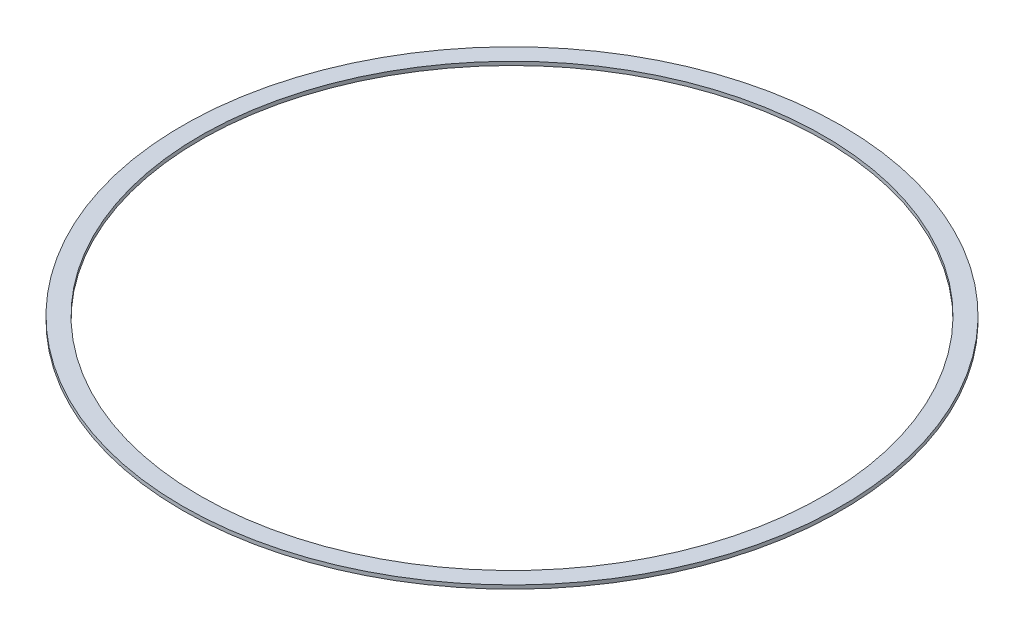
ISO-10303-21;
HEADER;
FILE_DESCRIPTION(('STEP AP214'),'2;1');
FILE_NAME('part.step','',(''),(''),'','','');
FILE_SCHEMA(('AUTOMOTIVE_DESIGN { 1 0 10303 214 1 1 1 1 }'));
ENDSEC;
DATA;
#1=APPLICATION_CONTEXT('core data for automotive mechanical design processes');
#2=APPLICATION_PROTOCOL_DEFINITION('international standard','automotive_design',2000,#1);
#3=PRODUCT_CONTEXT('',#1,'mechanical');
#4=PRODUCT('Part','Part','',(#3));
#5=PRODUCT_RELATED_PRODUCT_CATEGORY('part','',(#4));
#6=PRODUCT_DEFINITION_FORMATION('','',#4);
#7=PRODUCT_DEFINITION_CONTEXT('part definition',#1,'design');
#8=PRODUCT_DEFINITION('design','',#6,#7);
#9=PRODUCT_DEFINITION_SHAPE('','',#8);
#10=(LENGTH_UNIT() NAMED_UNIT(*) SI_UNIT(.MILLI.,.METRE.));
#11=(NAMED_UNIT(*) PLANE_ANGLE_UNIT() SI_UNIT($,.RADIAN.));
#12=(NAMED_UNIT(*) SI_UNIT($,.STERADIAN.) SOLID_ANGLE_UNIT());
#13=UNCERTAINTY_MEASURE_WITH_UNIT(LENGTH_MEASURE(1.E-05),#10,'distance_accuracy_value','');
#14=(GEOMETRIC_REPRESENTATION_CONTEXT(3) GLOBAL_UNCERTAINTY_ASSIGNED_CONTEXT((#13)) GLOBAL_UNIT_ASSIGNED_CONTEXT((#10,
#11,#12)) REPRESENTATION_CONTEXT('',''));
#15=CARTESIAN_POINT('',(0.,0.,0.));
#16=DIRECTION('',(0.,0.,1.));
#17=DIRECTION('',(1.,0.,0.));
#18=AXIS2_PLACEMENT_3D('',#15,#16,#17);
#19=CARTESIAN_POINT('',(0.,2.54,0.));
#20=DIRECTION('',(0.,1.,0.));
#21=DIRECTION('',(0.,0.,1.));
#22=AXIS2_PLACEMENT_3D('',#19,#20,#21);
#23=PLANE('',#22);
#24=CARTESIAN_POINT('',(0.,2.54,0.));
#25=DIRECTION('',(0.,1.,0.));
#26=DIRECTION('',(0.,0.,1.));
#27=AXIS2_PLACEMENT_3D('',#24,#25,#26);
#28=CIRCLE('',#27,226.8601);
#29=CARTESIAN_POINT('',(0.,2.54,226.8601));
#30=VERTEX_POINT('',#29);
#31=EDGE_CURVE('E10',#30,#30,#28,.T.);
#32=ORIENTED_EDGE('',*,*,#31,.T.);
#33=EDGE_LOOP('',(#32));
#34=FACE_BOUND('',#33,.T.);
#35=CARTESIAN_POINT('',(0.,2.54,0.));
#36=DIRECTION('',(0.,1.,0.));
#37=DIRECTION('',(0.,0.,1.));
#38=AXIS2_PLACEMENT_3D('',#35,#36,#37);
#39=CIRCLE('',#38,214.6681);
#40=CARTESIAN_POINT('',(0.,2.54,214.6681));
#41=VERTEX_POINT('',#40);
#42=EDGE_CURVE('E55',#41,#41,#39,.T.);
#43=ORIENTED_EDGE('',*,*,#42,.F.);
#44=EDGE_LOOP('',(#43));
#45=FACE_BOUND('',#44,.T.);
#46=ADVANCED_FACE('F42',(#34,#45),#23,.T.);
#47=CARTESIAN_POINT('',(0.,0.,0.));
#48=DIRECTION('',(0.,1.,0.));
#49=DIRECTION('',(0.,0.,1.));
#50=AXIS2_PLACEMENT_3D('',#47,#48,#49);
#51=PLANE('',#50);
#52=CARTESIAN_POINT('',(0.,0.,0.));
#53=DIRECTION('',(0.,1.,0.));
#54=DIRECTION('',(0.,0.,1.));
#55=AXIS2_PLACEMENT_3D('',#52,#53,#54);
#56=CIRCLE('',#55,226.8601);
#57=CARTESIAN_POINT('',(0.,0.,226.8601));
#58=VERTEX_POINT('',#57);
#59=EDGE_CURVE('E46',#58,#58,#56,.T.);
#60=ORIENTED_EDGE('',*,*,#59,.F.);
#61=EDGE_LOOP('',(#60));
#62=FACE_BOUND('',#61,.T.);
#63=CARTESIAN_POINT('',(0.,0.,0.));
#64=DIRECTION('',(0.,1.,0.));
#65=DIRECTION('',(0.,0.,1.));
#66=AXIS2_PLACEMENT_3D('',#63,#64,#65);
#67=CIRCLE('',#66,214.6681);
#68=CARTESIAN_POINT('',(0.,0.,214.6681));
#69=VERTEX_POINT('',#68);
#70=EDGE_CURVE('E57',#69,#69,#67,.T.);
#71=ORIENTED_EDGE('',*,*,#70,.T.);
#72=EDGE_LOOP('',(#71));
#73=FACE_BOUND('',#72,.T.);
#74=ADVANCED_FACE('F69',(#62,#73),#51,.F.);
#75=CARTESIAN_POINT('',(0.,2.54,0.));
#76=DIRECTION('',(0.,-1.,0.));
#77=DIRECTION('',(0.,0.,-1.));
#78=AXIS2_PLACEMENT_3D('',#75,#76,#77);
#79=CYLINDRICAL_SURFACE('',#78,226.8601);
#80=ORIENTED_EDGE('',*,*,#31,.F.);
#81=EDGE_LOOP('',(#80));
#82=FACE_BOUND('',#81,.T.);
#83=ORIENTED_EDGE('',*,*,#59,.T.);
#84=EDGE_LOOP('',(#83));
#85=FACE_BOUND('',#84,.T.);
#86=ADVANCED_FACE('F44',(#82,#85),#79,.T.);
#87=CARTESIAN_POINT('',(0.,2.54,0.));
#88=DIRECTION('',(0.,-1.,0.));
#89=DIRECTION('',(0.,0.,-1.));
#90=AXIS2_PLACEMENT_3D('',#87,#88,#89);
#91=CYLINDRICAL_SURFACE('',#90,214.6681);
#92=ORIENTED_EDGE('',*,*,#42,.T.);
#93=EDGE_LOOP('',(#92));
#94=FACE_BOUND('',#93,.T.);
#95=ORIENTED_EDGE('',*,*,#70,.F.);
#96=EDGE_LOOP('',(#95));
#97=FACE_BOUND('',#96,.T.);
#98=ADVANCED_FACE('F65',(#94,#97),#91,.F.);
#99=CLOSED_SHELL('',(#46,#74,#86,#98));
#100=MANIFOLD_SOLID_BREP('B2',#99);
#101=ADVANCED_BREP_SHAPE_REPRESENTATION('',(#18,#100),#14);
#102=SHAPE_DEFINITION_REPRESENTATION(#9,#101);
ENDSEC;
END-ISO-10303-21;
